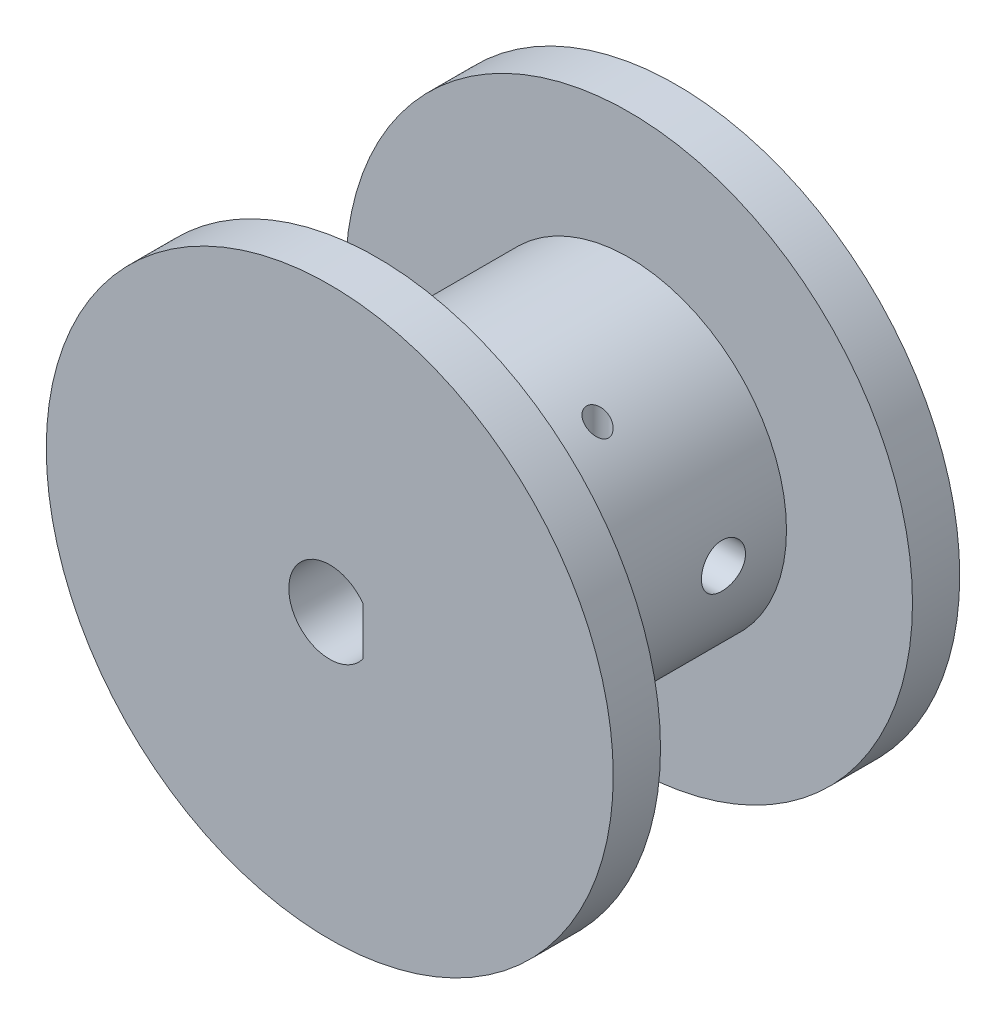
ISO-10303-21;
HEADER;
FILE_DESCRIPTION(('STEP AP214'),'2;1');
FILE_NAME('part.step','',(''),(''),'','','');
FILE_SCHEMA(('AUTOMOTIVE_DESIGN { 1 0 10303 214 1 1 1 1 }'));
ENDSEC;
DATA;
#1=APPLICATION_CONTEXT('core data for automotive mechanical design processes');
#2=APPLICATION_PROTOCOL_DEFINITION('international standard','automotive_design',2000,#1);
#3=PRODUCT_CONTEXT('',#1,'mechanical');
#4=PRODUCT('Part','Part','',(#3));
#5=PRODUCT_RELATED_PRODUCT_CATEGORY('part','',(#4));
#6=PRODUCT_DEFINITION_FORMATION('','',#4);
#7=PRODUCT_DEFINITION_CONTEXT('part definition',#1,'design');
#8=PRODUCT_DEFINITION('design','',#6,#7);
#9=PRODUCT_DEFINITION_SHAPE('','',#8);
#10=(LENGTH_UNIT() NAMED_UNIT(*) SI_UNIT(.MILLI.,.METRE.));
#11=(NAMED_UNIT(*) PLANE_ANGLE_UNIT() SI_UNIT($,.RADIAN.));
#12=(NAMED_UNIT(*) SI_UNIT($,.STERADIAN.) SOLID_ANGLE_UNIT());
#13=UNCERTAINTY_MEASURE_WITH_UNIT(LENGTH_MEASURE(1.E-05),#10,'distance_accuracy_value','');
#14=(GEOMETRIC_REPRESENTATION_CONTEXT(3) GLOBAL_UNCERTAINTY_ASSIGNED_CONTEXT((#13)) GLOBAL_UNIT_ASSIGNED_CONTEXT((#10,
#11,#12)) REPRESENTATION_CONTEXT('',''));
#15=CARTESIAN_POINT('',(0.,0.,0.));
#16=DIRECTION('',(0.,0.,1.));
#17=DIRECTION('',(1.,0.,0.));
#18=AXIS2_PLACEMENT_3D('',#15,#16,#17);
#19=CARTESIAN_POINT('',(0.,0.,0.));
#20=DIRECTION('',(0.,0.,-1.));
#21=DIRECTION('',(1.,0.,0.));
#22=AXIS2_PLACEMENT_3D('',#19,#20,#21);
#23=CYLINDRICAL_SURFACE('',#22,18.);
#24=CARTESIAN_POINT('',(0.,0.,0.));
#25=DIRECTION('',(0.,0.,1.));
#26=DIRECTION('',(1.,0.,0.));
#27=AXIS2_PLACEMENT_3D('',#24,#25,#26);
#28=CIRCLE('',#27,18.);
#29=CARTESIAN_POINT('',(18.,0.,0.));
#30=VERTEX_POINT('',#29);
#31=EDGE_CURVE('E25',#30,#30,#28,.T.);
#32=ORIENTED_EDGE('',*,*,#31,.T.);
#33=DIRECTION('',(0.,0.,1.));
#34=VECTOR('',#33,1.);
#35=CARTESIAN_POINT('',(18.,0.,0.));
#36=LINE('',#35,#34);
#37=CARTESIAN_POINT('',(18.,0.,3.));
#38=VERTEX_POINT('',#37);
#39=EDGE_CURVE('E10',#30,#38,#36,.T.);
#40=ORIENTED_EDGE('',*,*,#39,.T.);
#41=CARTESIAN_POINT('',(0.,0.,3.));
#42=DIRECTION('',(0.,0.,1.));
#43=DIRECTION('',(1.,0.,0.));
#44=AXIS2_PLACEMENT_3D('',#41,#42,#43);
#45=CIRCLE('',#44,18.);
#46=EDGE_CURVE('E106',#38,#38,#45,.T.);
#47=ORIENTED_EDGE('',*,*,#46,.F.);
#48=ORIENTED_EDGE('',*,*,#39,.F.);
#49=EDGE_LOOP('',(#32,#40,#47,#48));
#50=FACE_BOUND('',#49,.T.);
#51=ADVANCED_FACE('F16',(#50),#23,.T.);
#52=CARTESIAN_POINT('',(0.,0.,0.));
#53=DIRECTION('',(0.,0.,1.));
#54=DIRECTION('',(1.,0.,0.));
#55=AXIS2_PLACEMENT_3D('',#52,#53,#54);
#56=PLANE('',#55);
#57=CARTESIAN_POINT('',(0.,0.,0.));
#58=DIRECTION('',(0.,0.,-1.));
#59=DIRECTION('',(1.,0.,0.));
#60=AXIS2_PLACEMENT_3D('',#57,#58,#59);
#61=CIRCLE('',#60,2.6);
#62=CARTESIAN_POINT('',(2.1,-1.532970971676,0.));
#63=VERTEX_POINT('',#62);
#64=CARTESIAN_POINT('',(2.1,1.532970971676,0.));
#65=VERTEX_POINT('',#64);
#66=EDGE_CURVE('E117',#63,#65,#61,.T.);
#67=ORIENTED_EDGE('',*,*,#66,.F.);
#68=DIRECTION('',(0.,1.,0.));
#69=VECTOR('',#68,1.);
#70=CARTESIAN_POINT('',(2.1,-1.3,0.));
#71=LINE('',#70,#69);
#72=EDGE_CURVE('E128',#63,#65,#71,.T.);
#73=ORIENTED_EDGE('',*,*,#72,.T.);
#74=EDGE_LOOP('',(#67,#73));
#75=FACE_BOUND('',#74,.T.);
#76=ORIENTED_EDGE('',*,*,#31,.F.);
#77=EDGE_LOOP('',(#76));
#78=FACE_BOUND('',#77,.T.);
#79=ADVANCED_FACE('F18',(#75,#78),#56,.F.);
#80=CARTESIAN_POINT('',(6.,20.,11.));
#81=DIRECTION('',(0.,1.,0.));
#82=DIRECTION('',(1.,0.,0.));
#83=AXIS2_PLACEMENT_3D('',#80,#81,#82);
#84=CYLINDRICAL_SURFACE('',#83,0.7);
#85=CARTESIAN_POINT('',(6.7,7.423610981187,11.));
#86=CARTESIAN_POINT('',(6.7,7.423610981187,11.061420163176));
#87=CARTESIAN_POINT('',(6.693532975308,7.429447600473,11.122754671505));
#88=CARTESIAN_POINT('',(6.680632709645,7.441090597171,11.183098192978));
#89=CARTESIAN_POINT('',(6.661520256542,7.458262973313,11.24155588298));
#90=CARTESIAN_POINT('',(6.636601886671,7.480449371539,11.297273795192));
#91=CARTESIAN_POINT('',(6.595796443133,7.516360339853,11.368085013772));
#92=CARTESIAN_POINT('',(6.584424511656,7.526335762921,11.386239650214));
#93=CARTESIAN_POINT('',(6.572411678957,7.53683522499,11.403938417637));
#94=CARTESIAN_POINT('',(6.559781217614,7.547830749187,11.421155499173));
#95=CARTESIAN_POINT('',(6.546556959473,7.559293875357,11.437867222008));
#96=CARTESIAN_POINT('',(6.501960020964,7.597774091174,11.490195168881));
#97=CARTESIAN_POINT('',(6.46832721929,7.626531666773,11.523698047556));
#98=CARTESIAN_POINT('',(6.432123449108,7.657158813957,11.554339959049));
#99=CARTESIAN_POINT('',(6.393617223354,7.689342566472,11.581920111358));
#100=CARTESIAN_POINT('',(6.353091890638,7.722770795535,11.606257993675));
#101=CARTESIAN_POINT('',(6.258811586842,7.799472927624,11.652985313187));
#102=CARTESIAN_POINT('',(6.20411790761,7.843273272387,11.673638278514));
#103=CARTESIAN_POINT('',(6.147355183932,7.887943549649,11.688823903646));
#104=CARTESIAN_POINT('',(6.089143902674,7.932913952525,11.698287434595));
#105=CARTESIAN_POINT('',(6.030139770779,7.977646487715,11.701848317146));
#106=CARTESIAN_POINT('',(5.91087005233,8.066426752755,11.696908731573));
#107=CARTESIAN_POINT('',(5.850590582323,8.110455682424,11.688190677623));
#108=CARTESIAN_POINT('',(5.791081437799,8.153082869391,11.673140201952));
#109=CARTESIAN_POINT('',(5.733238053439,8.193743142968,11.651837184436));
#110=CARTESIAN_POINT('',(5.677927203744,8.231955757717,11.624540370653));
#111=CARTESIAN_POINT('',(5.577504946575,8.300293496152,11.561054925864));
#112=CARTESIAN_POINT('',(5.532003137056,8.330759241346,11.525627389309));
#113=CARTESIAN_POINT('',(5.490076266743,8.358416380811,11.485764177875));
#114=CARTESIAN_POINT('',(5.452291438685,8.383027386573,11.44195216543));
#115=CARTESIAN_POINT('',(5.419118280647,8.404420250563,11.394785949125));
#116=CARTESIAN_POINT('',(5.36129132756,8.441432989465,11.292678361777));
#117=CARTESIAN_POINT('',(5.33712915028,8.456721903805,11.23745857878));
#118=CARTESIAN_POINT('',(5.318744644311,8.468260971439,11.17997836171));
#119=CARTESIAN_POINT('',(5.306370909869,8.475994277313,11.120973813692));
#120=CARTESIAN_POINT('',(5.300126506963,8.479897347958,11.061211317834));
#121=CARTESIAN_POINT('',(5.299916523227,8.480028588211,10.960824351901));
#122=CARTESIAN_POINT('',(5.302662862186,8.47831208954,10.920174360154));
#123=CARTESIAN_POINT('',(5.308241963266,8.47482539965,10.87975351697));
#124=CARTESIAN_POINT('',(5.316630550833,8.46957309751,10.839798604194));
#125=CARTESIAN_POINT('',(5.327781638656,8.462565271847,10.800542407666));
#126=CARTESIAN_POINT('',(5.348599341269,8.449411407784,10.742903432129));
#127=CARTESIAN_POINT('',(5.356256004786,8.444563830289,10.723830876313));
#128=CARTESIAN_POINT('',(5.364586161912,8.439277434952,10.705024505533));
#129=CARTESIAN_POINT('',(5.37357854278,8.433555290088,10.686513974385));
#130=CARTESIAN_POINT('',(5.383219946253,8.427401254546,10.668328633745));
#131=CARTESIAN_POINT('',(5.421832205693,8.402670285586,10.601323329893));
#132=CARTESIAN_POINT('',(5.455012481143,8.381257029193,10.554804335829));
#133=CARTESIAN_POINT('',(5.492698816365,8.356691629017,10.511609025122));
#134=CARTESIAN_POINT('',(5.534430085028,8.329144046304,10.472313228275));
#135=CARTESIAN_POINT('',(5.579651521336,8.298847750574,10.437388068836));
#136=CARTESIAN_POINT('',(5.662585482144,8.242384495224,10.385309871925));
#137=CARTESIAN_POINT('',(5.698917998809,8.217390657414,10.365921049236));
#138=CARTESIAN_POINT('',(5.736500157893,8.191243269006,10.349154633775));
#139=CARTESIAN_POINT('',(5.775073989581,8.16408094826,10.335107466314));
#140=CARTESIAN_POINT('',(5.814371790981,8.136060754353,10.323838787263));
#141=CARTESIAN_POINT('',(5.931768447205,8.051291543394,10.29882445447));
#142=CARTESIAN_POINT('',(6.010993571128,7.992727375068,10.292990488834));
#143=CARTESIAN_POINT('',(6.090088070553,7.932754295284,10.297873697529));
#144=CARTESIAN_POINT('',(6.167391253484,7.872608031572,10.313195901261));
#145=CARTESIAN_POINT('',(6.241346146774,7.813677462955,10.338400572407));
#146=CARTESIAN_POINT('',(6.352184245195,7.723511933627,10.393266956371));
#147=CARTESIAN_POINT('',(6.392158095265,7.690547999272,10.417183943095));
#148=CARTESIAN_POINT('',(6.43017645922,7.658787058651,10.444252795814));
#149=CARTESIAN_POINT('',(6.465968124576,7.628527498068,10.474301287601));
#150=CARTESIAN_POINT('',(6.499275765807,7.600068704935,10.507138139574));
#151=CARTESIAN_POINT('',(6.543922714996,7.561575278007,10.558851812687));
#152=CARTESIAN_POINT('',(6.557413401678,7.549889225285,10.575693913783));
#153=CARTESIAN_POINT('',(6.570298101718,7.538679103142,10.59305743974));
#154=CARTESIAN_POINT('',(6.582552014467,7.527974507574,10.610917990655));
#155=CARTESIAN_POINT('',(6.594150908199,7.517804555788,10.629248931725));
#156=CARTESIAN_POINT('',(6.635614063146,7.481328814013,10.700526438729));
#157=CARTESIAN_POINT('',(6.66091413908,7.458807533322,10.756597917506));
#158=CARTESIAN_POINT('',(6.68032556855,7.441367808296,10.81547174188));
#159=CARTESIAN_POINT('',(6.693430112146,7.429540434902,10.876275215473));
#160=CARTESIAN_POINT('',(6.7,7.423610981187,10.938093293157));
#161=CARTESIAN_POINT('',(6.7,7.423610981187,11.));
#162=(BOUNDED_CURVE() B_SPLINE_CURVE(6,(#85,#86,#87,#88,#89,#90,#91,#92,#93,#94,#95,#96,#97,#98,
#99,#100,#101,#102,#103,#104,#105,#106,#107,#108,#109,#110,#111,#112,#113,#114,#115,#116,#117,
#118,#119,#120,#121,#122,#123,#124,#125,#126,#127,#128,#129,#130,#131,#132,#133,#134,#135,#136,
#137,#138,#139,#140,#141,#142,#143,#144,#145,#146,#147,#148,#149,#150,#151,#152,#153,#154,#155,
#156,#157,#158,#159,#160,#161),.UNSPECIFIED.,.T.,.F.) B_SPLINE_CURVE_WITH_KNOTS((7,5,5,5,5,5,5,
5,5,5,5,5,5,5,5,7),(0.,0.08286151673279,0.112342981733,0.178179417654,0.259286098523,
0.341845266376,0.418789774287,0.499511354963,0.554418021429,0.582077179904,0.658354963559,
0.713613191653,0.821552318295,0.886504016402,0.91639562001,1.),
.UNSPECIFIED.) CURVE() GEOMETRIC_REPRESENTATION_ITEM() RATIONAL_B_SPLINE_CURVE((1.,1.,1.,1.,1.,
1.,1.,1.,1.,1.,1.,1.,1.,1.,1.,1.,1.,1.,1.,1.,1.,1.,1.,1.,1.,1.,1.,1.,1.,1.,1.,1.,1.,1.,1.,1.,1.,
1.,1.,1.,1.,1.,1.,1.,1.,1.,1.,1.,1.,1.,1.,1.,1.,1.,1.,1.,1.,1.,1.,1.,1.,1.,1.,1.,1.,1.,1.,1.,1.,
1.,1.,1.,1.,1.,1.,1.,1.)) REPRESENTATION_ITEM(''));
#163=CARTESIAN_POINT('',(6.7,7.423610981187,11.));
#164=VERTEX_POINT('',#163);
#165=EDGE_CURVE('E102',#164,#164,#162,.T.);
#166=ORIENTED_EDGE('',*,*,#165,.F.);
#167=DIRECTION('',(0.,-1.,0.));
#168=VECTOR('',#167,1.);
#169=CARTESIAN_POINT('',(6.7,20.,11.));
#170=LINE('',#169,#168);
#171=CARTESIAN_POINT('',(6.7,-7.423610981187,11.));
#172=VERTEX_POINT('',#171);
#173=EDGE_CURVE('E97',#164,#172,#170,.T.);
#174=ORIENTED_EDGE('',*,*,#173,.T.);
#175=CARTESIAN_POINT('',(6.7,-7.423610981187,11.));
#176=CARTESIAN_POINT('',(6.7,-7.423610981187,11.061420163176));
#177=CARTESIAN_POINT('',(6.693532975308,-7.429447600473,11.122754671505));
#178=CARTESIAN_POINT('',(6.680632709645,-7.441090597171,11.183098192978));
#179=CARTESIAN_POINT('',(6.661520256542,-7.458262973313,11.24155588298));
#180=CARTESIAN_POINT('',(6.636601886671,-7.480449371539,11.297273795192));
#181=CARTESIAN_POINT('',(6.595796443133,-7.516360339853,11.368085013772));
#182=CARTESIAN_POINT('',(6.584424511656,-7.526335762921,11.386239650214));
#183=CARTESIAN_POINT('',(6.572411678957,-7.53683522499,11.403938417637));
#184=CARTESIAN_POINT('',(6.559781217614,-7.547830749187,11.421155499173));
#185=CARTESIAN_POINT('',(6.546556959473,-7.559293875357,11.437867222008));
#186=CARTESIAN_POINT('',(6.501960020964,-7.597774091174,11.490195168881));
#187=CARTESIAN_POINT('',(6.46832721929,-7.626531666773,11.523698047556));
#188=CARTESIAN_POINT('',(6.432123449108,-7.657158813957,11.554339959049));
#189=CARTESIAN_POINT('',(6.393617223354,-7.689342566472,11.581920111358));
#190=CARTESIAN_POINT('',(6.353091890638,-7.722770795535,11.606257993675));
#191=CARTESIAN_POINT('',(6.258811586833,-7.799472927631,11.652985313191));
#192=CARTESIAN_POINT('',(6.204117907613,-7.843273272385,11.67363827851));
#193=CARTESIAN_POINT('',(6.147355183943,-7.887943549641,11.688823903644));
#194=CARTESIAN_POINT('',(6.089143902677,-7.932913952523,11.698287434598));
#195=CARTESIAN_POINT('',(6.030139770768,-7.977646487724,11.701848317146));
#196=CARTESIAN_POINT('',(5.91087005233,-8.066426752755,11.696908731573));
#197=CARTESIAN_POINT('',(5.850590582323,-8.110455682424,11.688190677623));
#198=CARTESIAN_POINT('',(5.791081437799,-8.153082869391,11.673140201952));
#199=CARTESIAN_POINT('',(5.733238053439,-8.193743142968,11.651837184436));
#200=CARTESIAN_POINT('',(5.677927203744,-8.231955757717,11.624540370653));
#201=CARTESIAN_POINT('',(5.577504946575,-8.300293496152,11.561054925864));
#202=CARTESIAN_POINT('',(5.532003137056,-8.330759241346,11.525627389309));
#203=CARTESIAN_POINT('',(5.490076266743,-8.358416380811,11.485764177875));
#204=CARTESIAN_POINT('',(5.452291438685,-8.383027386573,11.44195216543));
#205=CARTESIAN_POINT('',(5.419118280647,-8.404420250563,11.394785949125));
#206=CARTESIAN_POINT('',(5.36129132756,-8.441432989465,11.292678361777));
#207=CARTESIAN_POINT('',(5.33712915028,-8.456721903805,11.23745857878));
#208=CARTESIAN_POINT('',(5.318744644311,-8.468260971439,11.17997836171));
#209=CARTESIAN_POINT('',(5.306370909869,-8.475994277313,11.120973813692));
#210=CARTESIAN_POINT('',(5.300126506963,-8.479897347958,11.061211317834));
#211=CARTESIAN_POINT('',(5.299916523227,-8.480028588211,10.960824351901));
#212=CARTESIAN_POINT('',(5.302662862186,-8.47831208954,10.920174360154));
#213=CARTESIAN_POINT('',(5.308241963266,-8.47482539965,10.87975351697));
#214=CARTESIAN_POINT('',(5.316630550833,-8.46957309751,10.839798604194));
#215=CARTESIAN_POINT('',(5.327781638656,-8.462565271847,10.800542407666));
#216=CARTESIAN_POINT('',(5.348599341269,-8.449411407784,10.742903432129));
#217=CARTESIAN_POINT('',(5.356256004786,-8.444563830289,10.723830876313));
#218=CARTESIAN_POINT('',(5.364586161912,-8.439277434952,10.705024505533));
#219=CARTESIAN_POINT('',(5.37357854278,-8.433555290088,10.686513974385));
#220=CARTESIAN_POINT('',(5.383219946253,-8.427401254546,10.668328633745));
#221=CARTESIAN_POINT('',(5.421832205693,-8.402670285586,10.601323329893));
#222=CARTESIAN_POINT('',(5.455012481143,-8.381257029193,10.554804335829));
#223=CARTESIAN_POINT('',(5.492698816365,-8.356691629017,10.511609025122));
#224=CARTESIAN_POINT('',(5.534430085028,-8.329144046304,10.472313228275));
#225=CARTESIAN_POINT('',(5.579651521336,-8.298847750574,10.437388068836));
#226=CARTESIAN_POINT('',(5.662585482144,-8.242384495224,10.385309871925));
#227=CARTESIAN_POINT('',(5.698917998809,-8.217390657414,10.365921049236));
#228=CARTESIAN_POINT('',(5.736500157893,-8.191243269006,10.349154633775));
#229=CARTESIAN_POINT('',(5.775073989581,-8.16408094826,10.335107466314));
#230=CARTESIAN_POINT('',(5.814371790981,-8.136060754353,10.323838787263));
#231=CARTESIAN_POINT('',(5.931768447226,-8.05129154338,10.298824454466));
#232=CARTESIAN_POINT('',(6.010993571123,-7.99272737507,10.292990488841));
#233=CARTESIAN_POINT('',(6.090088070531,-7.932754295301,10.297873697527));
#234=CARTESIAN_POINT('',(6.16739125348,-7.872608031576,10.313195901253));
#235=CARTESIAN_POINT('',(6.241346146792,-7.81367746294,10.338400572416));
#236=CARTESIAN_POINT('',(6.352184245195,-7.723511933627,10.393266956371));
#237=CARTESIAN_POINT('',(6.392158095265,-7.690547999272,10.417183943095));
#238=CARTESIAN_POINT('',(6.43017645922,-7.658787058651,10.444252795814));
#239=CARTESIAN_POINT('',(6.465968124576,-7.628527498068,10.474301287601));
#240=CARTESIAN_POINT('',(6.499275765808,-7.600068704935,10.507138139574));
#241=CARTESIAN_POINT('',(6.543922714996,-7.561575278007,10.558851812687));
#242=CARTESIAN_POINT('',(6.557413401678,-7.549889225285,10.575693913783));
#243=CARTESIAN_POINT('',(6.570298101718,-7.538679103142,10.59305743974));
#244=CARTESIAN_POINT('',(6.582552014467,-7.527974507574,10.610917990655));
#245=CARTESIAN_POINT('',(6.594150908199,-7.517804555788,10.629248931725));
#246=CARTESIAN_POINT('',(6.635614063147,-7.481328814013,10.700526438729));
#247=CARTESIAN_POINT('',(6.66091413908,-7.458807533322,10.756597917506));
#248=CARTESIAN_POINT('',(6.680325568549,-7.441367808296,10.815471741879));
#249=CARTESIAN_POINT('',(6.693430112146,-7.429540434902,10.876275215474));
#250=CARTESIAN_POINT('',(6.7,-7.423610981187,10.938093293157));
#251=CARTESIAN_POINT('',(6.7,-7.423610981187,11.));
#252=(BOUNDED_CURVE() B_SPLINE_CURVE(6,(#175,#176,#177,#178,#179,#180,#181,#182,#183,#184,#185,
#186,#187,#188,#189,#190,#191,#192,#193,#194,#195,#196,#197,#198,#199,#200,#201,#202,#203,#204,
#205,#206,#207,#208,#209,#210,#211,#212,#213,#214,#215,#216,#217,#218,#219,#220,#221,#222,#223,
#224,#225,#226,#227,#228,#229,#230,#231,#232,#233,#234,#235,#236,#237,#238,#239,#240,#241,#242,
#243,#244,#245,#246,#247,#248,#249,#250,#251),.UNSPECIFIED.,.T.,
.F.) B_SPLINE_CURVE_WITH_KNOTS((7,5,5,5,5,5,5,5,5,5,5,5,5,5,5,7),(0.,0.08286151669822,
0.112342981686,0.178179417579,0.25928609843,0.341845266279,0.418789774187,0.49951135486,
0.554418021324,0.582077179798,0.65835496345,0.713613191541,0.821552318208,0.886504016347,
0.916395619969,1.),
.UNSPECIFIED.) CURVE() GEOMETRIC_REPRESENTATION_ITEM() RATIONAL_B_SPLINE_CURVE((1.,1.,1.,1.,1.,
1.,1.,1.,1.,1.,1.,1.,1.,1.,1.,1.,1.,1.,1.,1.,1.,1.,1.,1.,1.,1.,1.,1.,1.,1.,1.,1.,1.,1.,1.,1.,1.,
1.,1.,1.,1.,1.,1.,1.,1.,1.,1.,1.,1.,1.,1.,1.,1.,1.,1.,1.,1.,1.,1.,1.,1.,1.,1.,1.,1.,1.,1.,1.,1.,
1.,1.,1.,1.,1.,1.,1.,1.)) REPRESENTATION_ITEM(''));
#253=EDGE_CURVE('E105',#172,#172,#252,.T.);
#254=ORIENTED_EDGE('',*,*,#253,.T.);
#255=ORIENTED_EDGE('',*,*,#173,.F.);
#256=EDGE_LOOP('',(#166,#174,#254,#255));
#257=FACE_BOUND('',#256,.T.);
#258=ADVANCED_FACE('F99',(#257),#84,.F.);
#259=CARTESIAN_POINT('',(0.,0.,3.));
#260=DIRECTION('',(0.,0.,1.));
#261=DIRECTION('',(1.,0.,0.));
#262=AXIS2_PLACEMENT_3D('',#259,#260,#261);
#263=PLANE('',#262);
#264=CARTESIAN_POINT('',(0.,0.,3.));
#265=DIRECTION('',(0.,0.,1.));
#266=DIRECTION('',(1.,0.,0.));
#267=AXIS2_PLACEMENT_3D('',#264,#265,#266);
#268=CIRCLE('',#267,10.);
#269=CARTESIAN_POINT('',(10.,0.,3.));
#270=VERTEX_POINT('',#269);
#271=EDGE_CURVE('E132',#270,#270,#268,.T.);
#272=ORIENTED_EDGE('',*,*,#271,.F.);
#273=EDGE_LOOP('',(#272));
#274=FACE_BOUND('',#273,.T.);
#275=ORIENTED_EDGE('',*,*,#46,.T.);
#276=EDGE_LOOP('',(#275));
#277=FACE_BOUND('',#276,.T.);
#278=ADVANCED_FACE('F242',(#274,#277),#263,.T.);
#279=CARTESIAN_POINT('',(1.5,0.,7.));
#280=DIRECTION('',(-1.,0.,0.));
#281=DIRECTION('',(0.,1.,0.));
#282=AXIS2_PLACEMENT_3D('',#279,#280,#281);
#283=CYLINDRICAL_SURFACE('',#282,1.4);
#284=CARTESIAN_POINT('',(2.1,0.,7.));
#285=DIRECTION('',(-1.,0.,0.));
#286=DIRECTION('',(0.,1.,0.));
#287=AXIS2_PLACEMENT_3D('',#284,#285,#286);
#288=CIRCLE('',#287,1.4);
#289=CARTESIAN_POINT('',(2.1,1.4,7.));
#290=VERTEX_POINT('',#289);
#291=EDGE_CURVE('E120',#290,#290,#288,.T.);
#292=ORIENTED_EDGE('',*,*,#291,.T.);
#293=DIRECTION('',(1.,0.,0.));
#294=VECTOR('',#293,1.);
#295=CARTESIAN_POINT('',(1.5,1.4,7.));
#296=LINE('',#295,#294);
#297=CARTESIAN_POINT('',(9.901515035589,1.4,7.));
#298=VERTEX_POINT('',#297);
#299=EDGE_CURVE('E115',#290,#298,#296,.T.);
#300=ORIENTED_EDGE('',*,*,#299,.T.);
#301=CARTESIAN_POINT('',(9.901515035589,1.4,7.));
#302=CARTESIAN_POINT('',(9.901515035589,1.4,7.134298040237));
#303=CARTESIAN_POINT('',(9.903640130875,1.384970160413,7.268589139922));
#304=CARTESIAN_POINT('',(9.907890140904,1.354912335546,7.401660688283));
#305=CARTESIAN_POINT('',(9.914145916786,1.309630366842,7.532236162476));
#306=CARTESIAN_POINT('',(9.922162754959,1.248786389021,7.65884807891));
#307=CARTESIAN_POINT('',(9.931531765376,1.171952055942,7.779693624638));
#308=CARTESIAN_POINT('',(9.948179730155,1.018521665372,7.965159107079));
#309=CARTESIAN_POINT('',(9.955038071414,0.951348878908,8.034697429937));
#310=CARTESIAN_POINT('',(9.962042494822,0.877220953455,8.100112730271));
#311=CARTESIAN_POINT('',(9.968971917954,0.796263869732,8.160484738731));
#312=CARTESIAN_POINT('',(9.975572533991,0.708712220674,8.214865717801));
#313=CARTESIAN_POINT('',(9.981573511395,0.614919371267,8.262274427594));
#314=CARTESIAN_POINT('',(9.990223321868,0.4473069353,8.328636885616));
#315=CARTESIAN_POINT('',(9.993330588733,0.376585741878,8.351833805127));
#316=CARTESIAN_POINT('',(9.995933260826,0.303648928901,8.370847982723));
#317=CARTESIAN_POINT('',(9.997948600515,0.228986458656,8.385349327532));
#318=CARTESIAN_POINT('',(9.999315553896,0.153124780768,8.395108850329));
#319=CARTESIAN_POINT('',(10.,0.07661149265728,8.4));
#320=CARTESIAN_POINT('',(10.,0.,8.4));
#321=(BOUNDED_CURVE() B_SPLINE_CURVE(7,(#301,#302,#303,#304,#305,#306,#307,#308,#309,#310,#311,
#312,#313,#314,#315,#316,#317,#318,#319,#320),.UNSPECIFIED.,.F.,
.F.) B_SPLINE_CURVE_WITH_KNOTS((8,6,6,8),(0.,0.479122703375,0.788471642168,1.),
.UNSPECIFIED.) CURVE() GEOMETRIC_REPRESENTATION_ITEM() RATIONAL_B_SPLINE_CURVE((1.,1.,1.,1.,1.,
1.,1.,1.,1.,1.,1.,1.,1.,1.,1.,1.,1.,1.,1.,1.)) REPRESENTATION_ITEM(''));
#322=CARTESIAN_POINT('',(10.,0.,8.4));
#323=VERTEX_POINT('',#322);
#324=EDGE_CURVE('E141',#298,#323,#321,.T.);
#325=ORIENTED_EDGE('',*,*,#324,.T.);
#326=CARTESIAN_POINT('',(10.,0.,8.4));
#327=CARTESIAN_POINT('',(10.,-0.190635546012,8.4));
#328=CARTESIAN_POINT('',(9.99575997734,-0.376798379062,8.369715303774));
#329=CARTESIAN_POINT('',(9.987639043286,-0.552869533634,8.311702258982));
#330=CARTESIAN_POINT('',(9.976717520861,-0.714070276914,8.22966289985));
#331=CARTESIAN_POINT('',(9.96454544228,-0.856667749464,8.128392867031));
#332=CARTESIAN_POINT('',(9.952538717575,-0.978348518018,8.013720100293));
#333=CARTESIAN_POINT('',(9.931532089328,-1.171949070345,7.779697233605));
#334=CARTESIAN_POINT('',(9.922163217262,-1.24878272688,7.658854300596));
#335=CARTESIAN_POINT('',(9.914146162441,-1.309628935861,7.53224162339));
#336=CARTESIAN_POINT('',(9.90788989437,-1.354914097307,7.401660600399));
#337=CARTESIAN_POINT('',(9.903639753547,-1.384972827377,7.268580838195));
#338=CARTESIAN_POINT('',(9.901515035589,-1.4,7.134286087082));
#339=CARTESIAN_POINT('',(9.901515035589,-1.4,6.865701959763));
#340=CARTESIAN_POINT('',(9.903640130875,-1.384970160413,6.731410860078));
#341=CARTESIAN_POINT('',(9.907890140904,-1.354912335546,6.598339311717));
#342=CARTESIAN_POINT('',(9.914145916786,-1.309630366842,6.467763837523));
#343=CARTESIAN_POINT('',(9.922162754959,-1.248786389021,6.34115192109));
#344=CARTESIAN_POINT('',(9.931531765376,-1.171952055942,6.220306375362));
#345=CARTESIAN_POINT('',(9.952534945479,-0.978383282275,5.986321922475));
#346=CARTESIAN_POINT('',(9.964542600623,-0.85670155308,5.871625510799));
#347=CARTESIAN_POINT('',(9.97671905319,-0.714067881061,5.770319197342));
#348=CARTESIAN_POINT('',(9.987644027642,-0.552815610009,5.688262221335));
#349=CARTESIAN_POINT('',(9.995763498341,-0.376708006593,5.630259538256));
#350=CARTESIAN_POINT('',(10.,-0.190556349915,5.6));
#351=CARTESIAN_POINT('',(10.,0.,5.6));
#352=(BOUNDED_CURVE() B_SPLINE_CURVE(7,(#326,#327,#328,#329,#330,#331,#332,#333,#334,#335,#336,
#337,#338,#339,#340,#341,#342,#343,#344,#345,#346,#347,#348,#349,#350,#351),.UNSPECIFIED.,.F.,
.F.) B_SPLINE_CURVE_WITH_KNOTS((8,6,6,6,8),(0.,0.259233249005,0.500026793407,0.740841771471,1.),
.UNSPECIFIED.) CURVE() GEOMETRIC_REPRESENTATION_ITEM() RATIONAL_B_SPLINE_CURVE((1.,1.,1.,1.,1.,
1.,1.,1.,1.,1.,1.,1.,1.,1.,1.,1.,1.,1.,1.,1.,1.,1.,1.,1.,1.,1.)) REPRESENTATION_ITEM(''));
#353=CARTESIAN_POINT('',(10.,0.,5.6));
#354=VERTEX_POINT('',#353);
#355=EDGE_CURVE('E163',#323,#354,#352,.T.);
#356=ORIENTED_EDGE('',*,*,#355,.T.);
#357=CARTESIAN_POINT('',(10.,0.,5.6));
#358=CARTESIAN_POINT('',(10.,0.167747739612,5.6));
#359=CARTESIAN_POINT('',(9.996717003785,0.332690941998,5.623449316446));
#360=CARTESIAN_POINT('',(9.990349183427,0.490676962249,5.668937276187));
#361=CARTESIAN_POINT('',(9.981567826941,0.637973209536,5.734077348231));
#362=CARTESIAN_POINT('',(9.971407440037,0.77150280057,5.815565663907));
#363=CARTESIAN_POINT('',(9.960910095179,0.889121466665,5.909222479342));
#364=CARTESIAN_POINT('',(9.939012447563,1.109234564399,6.129335577076));
#365=CARTESIAN_POINT('',(9.927557193253,1.207446233009,6.261084542583));
#366=CARTESIAN_POINT('',(9.917530549097,1.28505205314,6.401412606408));
#367=CARTESIAN_POINT('',(9.909618525285,1.342689239539,6.547512855013));
#368=CARTESIAN_POINT('',(9.904216270258,1.380895184279,6.697185455819));
#369=CARTESIAN_POINT('',(9.901515035589,1.4,6.848586087001));
#370=CARTESIAN_POINT('',(9.901515035589,1.4,7.));
#371=(BOUNDED_CURVE() B_SPLINE_CURVE(7,(#357,#358,#359,#360,#361,#362,#363,#364,#365,#366,#367,
#368,#369,#370),.UNSPECIFIED.,.F.,.F.) B_SPLINE_CURVE_WITH_KNOTS((8,6,8),(0.,0.4580737268,1.),
.UNSPECIFIED.) CURVE() GEOMETRIC_REPRESENTATION_ITEM() RATIONAL_B_SPLINE_CURVE((1.,1.,1.,1.,1.,
1.,1.,1.,1.,1.,1.,1.,1.,1.)) REPRESENTATION_ITEM(''));
#372=EDGE_CURVE('E140',#354,#298,#371,.T.);
#373=ORIENTED_EDGE('',*,*,#372,.T.);
#374=ORIENTED_EDGE('',*,*,#299,.F.);
#375=EDGE_LOOP('',(#292,#300,#325,#356,#373,#374));
#376=FACE_BOUND('',#375,.T.);
#377=ADVANCED_FACE('F239',(#376),#283,.F.);
#378=CARTESIAN_POINT('',(0.,0.,-22.));
#379=DIRECTION('',(0.,0.,-1.));
#380=DIRECTION('',(1.,0.,0.));
#381=AXIS2_PLACEMENT_3D('',#378,#379,#380);
#382=CYLINDRICAL_SURFACE('',#381,2.6);
#383=ORIENTED_EDGE('',*,*,#66,.T.);
#384=DIRECTION('',(0.,0.,-1.));
#385=VECTOR('',#384,1.);
#386=CARTESIAN_POINT('',(2.1,1.532970971676,-22.));
#387=LINE('',#386,#385);
#388=CARTESIAN_POINT('',(2.1,1.532970971676,22.));
#389=VERTEX_POINT('',#388);
#390=EDGE_CURVE('E135',#389,#65,#387,.T.);
#391=ORIENTED_EDGE('',*,*,#390,.F.);
#392=CARTESIAN_POINT('',(0.,0.,22.));
#393=DIRECTION('',(0.,0.,-1.));
#394=DIRECTION('',(0.807692307692309,-0.589604219875225,0.));
#395=AXIS2_PLACEMENT_3D('',#392,#393,#394);
#396=CIRCLE('',#395,2.6);
#397=CARTESIAN_POINT('',(2.1,-1.532970971676,22.));
#398=VERTEX_POINT('',#397);
#399=EDGE_CURVE('E172',#398,#389,#396,.T.);
#400=ORIENTED_EDGE('',*,*,#399,.F.);
#401=DIRECTION('',(0.,0.,-1.));
#402=VECTOR('',#401,1.);
#403=CARTESIAN_POINT('',(2.1,-1.532970971676,-22.));
#404=LINE('',#403,#402);
#405=EDGE_CURVE('E122',#398,#63,#404,.T.);
#406=ORIENTED_EDGE('',*,*,#405,.T.);
#407=EDGE_LOOP('',(#383,#391,#400,#406));
#408=FACE_BOUND('',#407,.T.);
#409=ADVANCED_FACE('F245',(#408),#382,.F.);
#410=CARTESIAN_POINT('',(2.1,-2.6,-22.));
#411=DIRECTION('',(1.,0.,0.));
#412=DIRECTION('',(0.,1.,0.));
#413=AXIS2_PLACEMENT_3D('',#410,#411,#412);
#414=PLANE('',#413);
#415=ORIENTED_EDGE('',*,*,#291,.F.);
#416=EDGE_LOOP('',(#415));
#417=FACE_BOUND('',#416,.T.);
#418=ORIENTED_EDGE('',*,*,#390,.T.);
#419=ORIENTED_EDGE('',*,*,#72,.F.);
#420=ORIENTED_EDGE('',*,*,#405,.F.);
#421=DIRECTION('',(0.,1.,0.));
#422=VECTOR('',#421,1.);
#423=CARTESIAN_POINT('',(2.1,-2.6,22.));
#424=LINE('',#423,#422);
#425=EDGE_CURVE('E177',#398,#389,#424,.T.);
#426=ORIENTED_EDGE('',*,*,#425,.T.);
#427=EDGE_LOOP('',(#418,#419,#420,#426));
#428=FACE_BOUND('',#427,.T.);
#429=ADVANCED_FACE('F238',(#417,#428),#414,.F.);
#430=CARTESIAN_POINT('',(0.,0.,3.));
#431=DIRECTION('',(0.,0.,-1.));
#432=DIRECTION('',(1.,0.,0.));
#433=AXIS2_PLACEMENT_3D('',#430,#431,#432);
#434=CYLINDRICAL_SURFACE('',#433,10.);
#435=ORIENTED_EDGE('',*,*,#165,.T.);
#436=EDGE_LOOP('',(#435));
#437=FACE_BOUND('',#436,.T.);
#438=ORIENTED_EDGE('',*,*,#253,.F.);
#439=EDGE_LOOP('',(#438));
#440=FACE_BOUND('',#439,.T.);
#441=ORIENTED_EDGE('',*,*,#355,.F.);
#442=DIRECTION('',(0.,0.,1.));
#443=VECTOR('',#442,1.);
#444=CARTESIAN_POINT('',(10.,0.,3.));
#445=LINE('',#444,#443);
#446=CARTESIAN_POINT('',(10.,0.,19.));
#447=VERTEX_POINT('',#446);
#448=EDGE_CURVE('E151',#323,#447,#445,.T.);
#449=ORIENTED_EDGE('',*,*,#448,.T.);
#450=CARTESIAN_POINT('',(0.,0.,19.));
#451=DIRECTION('',(0.,0.,1.));
#452=DIRECTION('',(1.,0.,0.));
#453=AXIS2_PLACEMENT_3D('',#450,#451,#452);
#454=CIRCLE('',#453,10.);
#455=EDGE_CURVE('E183',#447,#447,#454,.T.);
#456=ORIENTED_EDGE('',*,*,#455,.F.);
#457=ORIENTED_EDGE('',*,*,#448,.F.);
#458=ORIENTED_EDGE('',*,*,#324,.F.);
#459=ORIENTED_EDGE('',*,*,#372,.F.);
#460=DIRECTION('',(0.,0.,1.));
#461=VECTOR('',#460,1.);
#462=CARTESIAN_POINT('',(10.,0.,3.));
#463=LINE('',#462,#461);
#464=EDGE_CURVE('E136',#270,#354,#463,.T.);
#465=ORIENTED_EDGE('',*,*,#464,.F.);
#466=ORIENTED_EDGE('',*,*,#271,.T.);
#467=ORIENTED_EDGE('',*,*,#464,.T.);
#468=EDGE_LOOP('',(#441,#449,#456,#457,#458,#459,#465,#466,#467));
#469=FACE_BOUND('',#468,.T.);
#470=ADVANCED_FACE('F221',(#437,#440,#469),#434,.T.);
#471=CARTESIAN_POINT('',(0.,0.,22.));
#472=DIRECTION('',(0.,0.,1.));
#473=DIRECTION('',(1.,0.,0.));
#474=AXIS2_PLACEMENT_3D('',#471,#472,#473);
#475=PLANE('',#474);
#476=ORIENTED_EDGE('',*,*,#425,.F.);
#477=ORIENTED_EDGE('',*,*,#399,.T.);
#478=EDGE_LOOP('',(#476,#477));
#479=FACE_BOUND('',#478,.T.);
#480=CARTESIAN_POINT('',(0.,0.,22.));
#481=DIRECTION('',(0.,0.,1.));
#482=DIRECTION('',(1.,0.,0.));
#483=AXIS2_PLACEMENT_3D('',#480,#481,#482);
#484=CIRCLE('',#483,18.);
#485=CARTESIAN_POINT('',(18.,0.,22.));
#486=VERTEX_POINT('',#485);
#487=EDGE_CURVE('E190',#486,#486,#484,.T.);
#488=ORIENTED_EDGE('',*,*,#487,.T.);
#489=EDGE_LOOP('',(#488));
#490=FACE_BOUND('',#489,.T.);
#491=ADVANCED_FACE('F214',(#479,#490),#475,.T.);
#492=CARTESIAN_POINT('',(0.,0.,19.));
#493=DIRECTION('',(0.,0.,1.));
#494=DIRECTION('',(1.,0.,0.));
#495=AXIS2_PLACEMENT_3D('',#492,#493,#494);
#496=PLANE('',#495);
#497=ORIENTED_EDGE('',*,*,#455,.T.);
#498=EDGE_LOOP('',(#497));
#499=FACE_BOUND('',#498,.T.);
#500=CARTESIAN_POINT('',(0.,0.,19.));
#501=DIRECTION('',(0.,0.,1.));
#502=DIRECTION('',(1.,0.,0.));
#503=AXIS2_PLACEMENT_3D('',#500,#501,#502);
#504=CIRCLE('',#503,18.);
#505=CARTESIAN_POINT('',(18.,0.,19.));
#506=VERTEX_POINT('',#505);
#507=EDGE_CURVE('E203',#506,#506,#504,.T.);
#508=ORIENTED_EDGE('',*,*,#507,.F.);
#509=EDGE_LOOP('',(#508));
#510=FACE_BOUND('',#509,.T.);
#511=ADVANCED_FACE('F213',(#499,#510),#496,.F.);
#512=CARTESIAN_POINT('',(0.,0.,19.));
#513=DIRECTION('',(0.,0.,-1.));
#514=DIRECTION('',(1.,0.,0.));
#515=AXIS2_PLACEMENT_3D('',#512,#513,#514);
#516=CYLINDRICAL_SURFACE('',#515,18.);
#517=ORIENTED_EDGE('',*,*,#507,.T.);
#518=DIRECTION('',(0.,0.,1.));
#519=VECTOR('',#518,1.);
#520=CARTESIAN_POINT('',(18.,0.,19.));
#521=LINE('',#520,#519);
#522=EDGE_CURVE('E189',#506,#486,#521,.T.);
#523=ORIENTED_EDGE('',*,*,#522,.T.);
#524=ORIENTED_EDGE('',*,*,#487,.F.);
#525=ORIENTED_EDGE('',*,*,#522,.F.);
#526=EDGE_LOOP('',(#517,#523,#524,#525));
#527=FACE_BOUND('',#526,.T.);
#528=ADVANCED_FACE('F209',(#527),#516,.T.);
#529=CLOSED_SHELL('',(#51,#79,#258,#278,#377,#409,#429,#470,#491,#511,#528));
#530=MANIFOLD_SOLID_BREP('B1',#529);
#531=ADVANCED_BREP_SHAPE_REPRESENTATION('',(#18,#530),#14);
#532=SHAPE_DEFINITION_REPRESENTATION(#9,#531);
ENDSEC;
END-ISO-10303-21;
